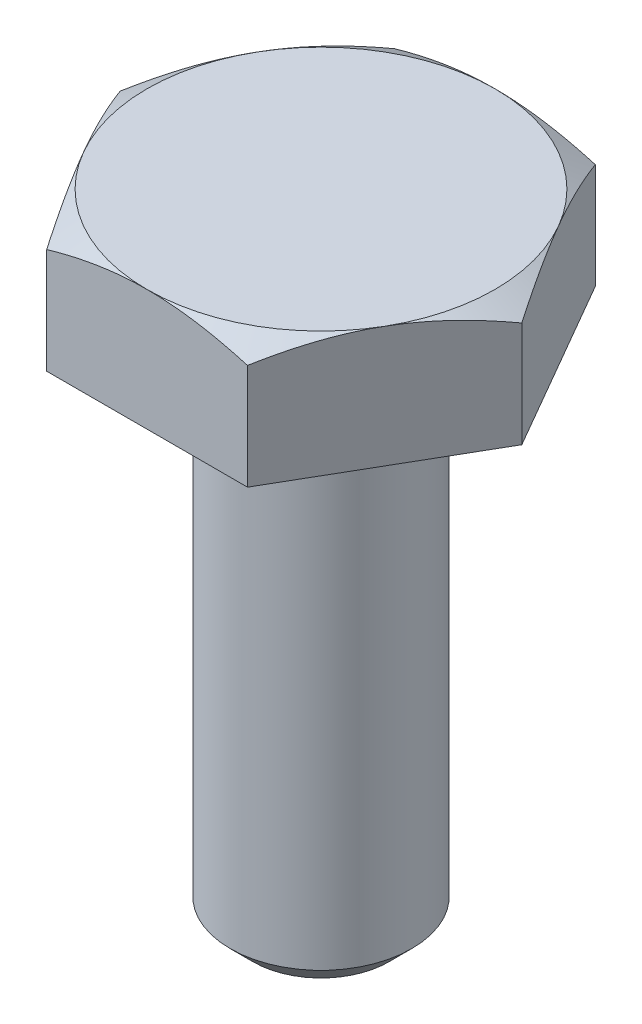
ISO-10303-21;
HEADER;
FILE_DESCRIPTION(('STEP AP214'),'2;1');
FILE_NAME('part.step','',(''),(''),'','','');
FILE_SCHEMA(('AUTOMOTIVE_DESIGN { 1 0 10303 214 1 1 1 1 }'));
ENDSEC;
DATA;
#1=APPLICATION_CONTEXT('core data for automotive mechanical design processes');
#2=APPLICATION_PROTOCOL_DEFINITION('international standard','automotive_design',2000,#1);
#3=PRODUCT_CONTEXT('',#1,'mechanical');
#4=PRODUCT('Part','Part','',(#3));
#5=PRODUCT_RELATED_PRODUCT_CATEGORY('part','',(#4));
#6=PRODUCT_DEFINITION_FORMATION('','',#4);
#7=PRODUCT_DEFINITION_CONTEXT('part definition',#1,'design');
#8=PRODUCT_DEFINITION('design','',#6,#7);
#9=PRODUCT_DEFINITION_SHAPE('','',#8);
#10=(LENGTH_UNIT() NAMED_UNIT(*) SI_UNIT(.MILLI.,.METRE.));
#11=(NAMED_UNIT(*) PLANE_ANGLE_UNIT() SI_UNIT($,.RADIAN.));
#12=(NAMED_UNIT(*) SI_UNIT($,.STERADIAN.) SOLID_ANGLE_UNIT());
#13=UNCERTAINTY_MEASURE_WITH_UNIT(LENGTH_MEASURE(1.E-05),#10,'distance_accuracy_value','');
#14=(GEOMETRIC_REPRESENTATION_CONTEXT(3) GLOBAL_UNCERTAINTY_ASSIGNED_CONTEXT((#13)) GLOBAL_UNIT_ASSIGNED_CONTEXT((#10,
#11,#12)) REPRESENTATION_CONTEXT('',''));
#15=CARTESIAN_POINT('',(0.,0.,0.));
#16=DIRECTION('',(0.,0.,1.));
#17=DIRECTION('',(1.,0.,0.));
#18=AXIS2_PLACEMENT_3D('',#15,#16,#17);
#19=CARTESIAN_POINT('',(0.,-4.,5.75000000000002));
#20=DIRECTION('',(0.,0.,1.));
#21=DIRECTION('',(1.,0.,0.));
#22=AXIS2_PLACEMENT_3D('',#19,#20,#21);
#23=PLANE('',#22);
#24=DIRECTION('',(0.,1.,0.));
#25=VECTOR('',#24,1.);
#26=CARTESIAN_POINT('',(3.31976404784035,-4.,5.75000000000002));
#27=LINE('',#26,#25);
#28=CARTESIAN_POINT('',(3.31976404784035,-4.,5.75000000000002));
#29=VERTEX_POINT('',#28);
#30=CARTESIAN_POINT('',(3.31976404784035,-0.513569285492992,5.75000000000002));
#31=VERTEX_POINT('',#30);
#32=EDGE_CURVE('E223',#29,#31,#27,.T.);
#33=ORIENTED_EDGE('',*,*,#32,.T.);
#34=CARTESIAN_POINT('',(11.0713080173293,-3.88292899514897,5.75000000000002));
#35=CARTESIAN_POINT('',(10.8123781364165,-3.75027954906554,5.75000000000002));
#36=CARTESIAN_POINT('',(10.5530584670346,-3.61838412466597,5.75000000000002));
#37=CARTESIAN_POINT('',(10.0334629710092,-3.35647802069559,5.75000000000002));
#38=CARTESIAN_POINT('',(9.77318712480957,-3.22646737994511,5.75000000000002));
#39=CARTESIAN_POINT('',(9.25107199836374,-2.96849497357768,5.75000000000002));
#40=CARTESIAN_POINT('',(8.98923081792818,-2.84053704683579,5.75000000000002));
#41=CARTESIAN_POINT('',(8.46419557327455,-2.58741309158795,5.75000000000002));
#42=CARTESIAN_POINT('',(8.20100148948035,-2.46224710362129,5.75000000000002));
#43=CARTESIAN_POINT('',(7.65942340661944,-2.20903102302215,5.75000000000002));
#44=CARTESIAN_POINT('',(7.38095389899236,-2.08116329088386,5.75000000000002));
#45=CARTESIAN_POINT('',(6.82184411600571,-1.83028757996101,5.75000000000002));
#46=CARTESIAN_POINT('',(6.54120395474192,-1.70727934779525,5.75000000000002));
#47=CARTESIAN_POINT('',(5.97745013692571,-1.46758165786437,5.75000000000002));
#48=CARTESIAN_POINT('',(5.69433829885842,-1.35088794569363,5.75000000000002));
#49=CARTESIAN_POINT('',(5.12481850383633,-1.12558004469787,5.75000000000002));
#50=CARTESIAN_POINT('',(4.83840976909219,-1.01696780947603,5.75000000000002));
#51=CARTESIAN_POINT('',(4.21157422588185,-0.792382003870331,5.75000000000002));
#52=CARTESIAN_POINT('',(3.87041947555574,-0.67841583327558,5.75000000000002));
#53=CARTESIAN_POINT('',(3.1820331395834,-0.470660731432122,5.75000000000002));
#54=CARTESIAN_POINT('',(2.83480483084519,-0.376861261802617,5.75000000000002));
#55=CARTESIAN_POINT('',(2.31256241062908,-0.257272828446657,5.75000000000002));
#56=CARTESIAN_POINT('',(2.13989891510111,-0.221175363365864,5.75000000000002));
#57=CARTESIAN_POINT('',(1.79317467008834,-0.156396317597844,5.75000000000002));
#58=CARTESIAN_POINT('',(1.61911395732723,-0.127714542654421,5.75000000000002));
#59=CARTESIAN_POINT('',(1.26990567780417,-0.0785939169627074,5.75000000000002));
#60=CARTESIAN_POINT('',(1.09475865311274,-0.0581512457265787,5.75000000000002));
#61=CARTESIAN_POINT('',(0.74364724237383,-0.0261523101735737,5.75000000000002));
#62=CARTESIAN_POINT('',(0.567682862169348,-0.0145959824291443,5.75000000000002));
#63=CARTESIAN_POINT('',(0.213243816290238,-0.000694780216979998,5.75000000000002));
#64=CARTESIAN_POINT('',(0.0347646314813361,0.00153644475867695,5.75000000000002));
#65=CARTESIAN_POINT('',(-0.322053382277163,-0.00360792614545602,5.75000000000002));
#66=CARTESIAN_POINT('',(-0.50039221086625,-0.0109835466207898,5.75000000000002));
#67=CARTESIAN_POINT('',(-0.856489322139348,-0.0350730360006631,5.75000000000002));
#68=CARTESIAN_POINT('',(-1.03424740413895,-0.0517898472946195,5.75000000000002));
#69=CARTESIAN_POINT('',(-1.38870760807907,-0.0939777025012408,5.75000000000002));
#70=CARTESIAN_POINT('',(-1.56540970529434,-0.119448950583023,5.75000000000002));
#71=CARTESIAN_POINT('',(-2.10039223807329,-0.208987600366526,5.75000000000002));
#72=CARTESIAN_POINT('',(-2.45658767310825,-0.285660332649734,5.75000000000002));
#73=CARTESIAN_POINT('',(-3.1623545433874,-0.464500590742711,5.75000000000002));
#74=CARTESIAN_POINT('',(-3.51192430769836,-0.566674458028985,5.75000000000002));
#75=CARTESIAN_POINT('',(-4.18052275964089,-0.781774135701555,5.75000000000002));
#76=CARTESIAN_POINT('',(-4.49996585898247,-0.893432381701488,5.75000000000002));
#77=CARTESIAN_POINT('',(-5.1344552507634,-1.12868043919671,5.75000000000002));
#78=CARTESIAN_POINT('',(-5.4495006120927,-1.25227273485205,5.75000000000002));
#79=CARTESIAN_POINT('',(-6.07625696744593,-1.50843122042611,5.75000000000002));
#80=CARTESIAN_POINT('',(-6.38796436654607,-1.64100614054922,5.75000000000002));
#81=CARTESIAN_POINT('',(-7.00841608296728,-1.91281341705002,5.75000000000002));
#82=CARTESIAN_POINT('',(-7.31716065097914,-2.05204520410644,5.75000000000002));
#83=CARTESIAN_POINT('',(-7.91565699090766,-2.32793407504152,5.75000000000002));
#84=CARTESIAN_POINT('',(-8.20553281049504,-2.46432309625606,5.75000000000002));
#85=CARTESIAN_POINT('',(-8.78357347762647,-2.7406937193813,5.75000000000002));
#86=CARTESIAN_POINT('',(-9.07173827505263,-2.88067542589306,5.75000000000002));
#87=CARTESIAN_POINT('',(-9.64580605137061,-3.16307241905551,5.75000000000002));
#88=CARTESIAN_POINT('',(-9.93171320771523,-3.30547923295431,5.75000000000002));
#89=CARTESIAN_POINT('',(-10.5023383771572,-3.59260033929941,5.75000000000002));
#90=CARTESIAN_POINT('',(-10.787056484661,-3.73731444398362,5.75000000000002));
#91=CARTESIAN_POINT('',(-11.0713080173293,-3.88292899514898,5.75000000000002));
#92=B_SPLINE_CURVE_WITH_KNOTS('',3,(#34,#35,#36,#37,#38,#39,#40,#41,#42,#43,#44,#45,#46,#47,#48,
#49,#50,#51,#52,#53,#54,#55,#56,#57,#58,#59,#60,#61,#62,#63,#64,#65,#66,#67,#68,#69,#70,#71,#72,
#73,#74,#75,#76,#77,#78,#79,#80,#81,#82,#83,#84,#85,#86,#87,#88,#89,#90,#91),.UNSPECIFIED.,.F.,
.F.,(4,2,2,2,2,2,2,2,2,2,2,2,2,2,2,2,2,2,2,2,2,2,2,2,2,2,2,2,4),(0.,0.87279492579926,
1.74560780283092,2.61989747067912,3.49419982506763,4.41343430819262,5.33262079770412,
6.25118007094176,7.16996067861817,8.24860694073194,9.32668816430342,9.85574436116752,
10.3847866978436,10.9135834335683,11.4423763948953,11.9775955477818,12.5128160709444,
13.0482052787734,13.5836069736833,14.675265844376,15.7671964535063,16.7820712051574,
17.7971576677229,18.8132452497826,19.8292460869682,20.7902935537496,21.7513690332513,
22.7095871006485,23.6677275844538),.UNSPECIFIED.);
#93=CARTESIAN_POINT('',(0.,0.,5.75));
#94=VERTEX_POINT('',#93);
#95=EDGE_CURVE('E66',#31,#94,#92,.T.);
#96=ORIENTED_EDGE('',*,*,#95,.T.);
#97=CARTESIAN_POINT('',(-3.31976404784035,-0.513569285492994,5.75000000000002));
#98=VERTEX_POINT('',#97);
#99=EDGE_CURVE('E163',#94,#98,#92,.T.);
#100=ORIENTED_EDGE('',*,*,#99,.T.);
#101=DIRECTION('',(0.,1.,0.));
#102=VECTOR('',#101,1.);
#103=CARTESIAN_POINT('',(-3.31976404784035,-4.,5.75000000000002));
#104=LINE('',#103,#102);
#105=CARTESIAN_POINT('',(-3.31976404784035,-4.,5.75000000000002));
#106=VERTEX_POINT('',#105);
#107=EDGE_CURVE('E240',#106,#98,#104,.T.);
#108=ORIENTED_EDGE('',*,*,#107,.F.);
#109=DIRECTION('',(1.,0.,0.));
#110=VECTOR('',#109,1.);
#111=CARTESIAN_POINT('',(0.,-4.,5.75000000000002));
#112=LINE('',#111,#110);
#113=EDGE_CURVE('E226',#106,#29,#112,.T.);
#114=ORIENTED_EDGE('',*,*,#113,.T.);
#115=EDGE_LOOP('',(#33,#96,#100,#108,#114));
#116=FACE_BOUND('',#115,.T.);
#117=ADVANCED_FACE('F45',(#116),#23,.T.);
#118=CARTESIAN_POINT('',(-4.97964607176053,-4.,2.87500000000001));
#119=DIRECTION('',(-0.866025403784438,0.,0.500000000000001));
#120=DIRECTION('',(0.500000000000001,0.,0.866025403784438));
#121=AXIS2_PLACEMENT_3D('',#118,#119,#120);
#122=PLANE('',#121);
#123=ORIENTED_EDGE('',*,*,#107,.T.);
#124=CARTESIAN_POINT('',(-3.31964857778652,-0.513635953898761,5.75020000000002));
#125=CARTESIAN_POINT('',(-3.3926209133299,-0.471511287144572,5.62380820729191));
#126=CARTESIAN_POINT('',(-3.46586532524055,-0.431298360537734,5.49694516449216));
#127=CARTESIAN_POINT('',(-3.61294897437243,-0.355222524189267,5.24218881123311));
#128=CARTESIAN_POINT('',(-3.68678845365557,-0.319361490988121,5.11429508151029));
#129=CARTESIAN_POINT('',(-3.90948916876067,-0.219010114576463,4.72856612806634));
#130=CARTESIAN_POINT('',(-4.05922948524038,-0.161931182517345,4.46920829198204));
#131=CARTESIAN_POINT('',(-4.28331314780295,-0.0949990243079389,4.08108400327753));
#132=CARTESIAN_POINT('',(-4.35698694396534,-0.0759319138580778,3.95347724513781));
#133=CARTESIAN_POINT('',(-4.50466743828745,-0.0439589649041536,3.69768712568503));
#134=CARTESIAN_POINT('',(-4.57867410644991,-0.0310525820171859,3.56950381632876));
#135=CARTESIAN_POINT('',(-4.72681598465025,-0.0117300113804247,3.31291455655709));
#136=CARTESIAN_POINT('',(-4.80095095271929,-0.00530645784718868,3.18450902524401));
#137=CARTESIAN_POINT('',(-4.94928528827318,0.000919606167718035,2.9275864195577));
#138=CARTESIAN_POINT('',(-5.0234846536979,0.000722321175925226,2.79906934875273));
#139=CARTESIAN_POINT('',(-5.22676904640718,-0.00891904858600412,2.44697045219446));
#140=CARTESIAN_POINT('',(-5.35578753678401,-0.0251059305716255,2.22350387174596));
#141=CARTESIAN_POINT('',(-5.61296758327851,-0.0764356634574781,1.77805496452456));
#142=CARTESIAN_POINT('',(-5.74112823487006,-0.111596060176641,1.55607420443687));
#143=CARTESIAN_POINT('',(-5.99882589662087,-0.199487238443291,1.10972876129276));
#144=CARTESIAN_POINT('',(-6.12833038860442,-0.252590422248932,0.885420401368853));
#145=CARTESIAN_POINT('',(-6.38540804552934,-0.373113373525025,0.440148838084137));
#146=CARTESIAN_POINT('',(-6.51298450303054,-0.440504828899112,0.219179931842406));
#147=CARTESIAN_POINT('',(-6.63964356573455,-0.513635953898759,-0.000199999999991778));
#148=B_SPLINE_CURVE_WITH_KNOTS('',3,(#124,#125,#126,#127,#128,#129,#130,#131,#132,#133,#134,
#135,#136,#137,#138,#139,#140,#141,#142,#143,#144,#145,#146,#147),.UNSPECIFIED.,.F.,.F.,(4,2,2,
2,2,2,2,2,2,2,2,4),(0.,0.455670765670929,0.911537324052956,1.82516476021489,2.27078912336574,
2.71637410233498,3.16145223624437,3.60651662110896,4.38133614054356,5.15687340779608,
5.94961152801382,6.74079328409406),.UNSPECIFIED.);
#149=CARTESIAN_POINT('',(-4.97964607176052,0.,2.875));
#150=VERTEX_POINT('',#149);
#151=EDGE_CURVE('E264',#98,#150,#148,.T.);
#152=ORIENTED_EDGE('',*,*,#151,.T.);
#153=CARTESIAN_POINT('',(-6.63952809568071,-0.513569285492993,0.));
#154=VERTEX_POINT('',#153);
#155=EDGE_CURVE('E189',#150,#154,#148,.T.);
#156=ORIENTED_EDGE('',*,*,#155,.T.);
#157=DIRECTION('',(0.,1.,0.));
#158=VECTOR('',#157,1.);
#159=CARTESIAN_POINT('',(-6.63952809568071,-4.,0.));
#160=LINE('',#159,#158);
#161=CARTESIAN_POINT('',(-6.63952809568071,-4.,0.));
#162=VERTEX_POINT('',#161);
#163=EDGE_CURVE('E270',#162,#154,#160,.T.);
#164=ORIENTED_EDGE('',*,*,#163,.F.);
#165=DIRECTION('',(0.500000000000001,0.,0.866025403784438));
#166=VECTOR('',#165,1.);
#167=CARTESIAN_POINT('',(-4.97964607176053,-4.,2.87500000000001));
#168=LINE('',#167,#166);
#169=EDGE_CURVE('E228',#162,#106,#168,.T.);
#170=ORIENTED_EDGE('',*,*,#169,.T.);
#171=EDGE_LOOP('',(#123,#152,#156,#164,#170));
#172=FACE_BOUND('',#171,.T.);
#173=ADVANCED_FACE('F199',(#172),#122,.T.);
#174=CARTESIAN_POINT('',(-4.97964607176054,-4.,-2.875));
#175=DIRECTION('',(-0.866025403784439,0.,-0.499999999999999));
#176=DIRECTION('',(-0.499999999999999,0.,0.866025403784439));
#177=AXIS2_PLACEMENT_3D('',#174,#175,#176);
#178=PLANE('',#177);
#179=ORIENTED_EDGE('',*,*,#163,.T.);
#180=CARTESIAN_POINT('',(-6.63964356573455,-0.51363595389876,0.000200000000007373));
#181=CARTESIAN_POINT('',(-6.56667123019117,-0.471511287144571,-0.126191792708097));
#182=CARTESIAN_POINT('',(-6.49342681828051,-0.431298360537732,-0.253054835507854));
#183=CARTESIAN_POINT('',(-6.34634316914863,-0.355222524189265,-0.507811188766905));
#184=CARTESIAN_POINT('',(-6.2725036898655,-0.31936149098812,-0.635704918489725));
#185=CARTESIAN_POINT('',(-6.0498029747604,-0.219010114576462,-1.02143387193367));
#186=CARTESIAN_POINT('',(-5.90006265828069,-0.161931182517343,-1.28079170801797));
#187=CARTESIAN_POINT('',(-5.67597899571811,-0.094999024307937,-1.66891599672248));
#188=CARTESIAN_POINT('',(-5.60230519955573,-0.0759319138580761,-1.7965227548622));
#189=CARTESIAN_POINT('',(-5.45462470523362,-0.043958964904152,-2.05231287431499));
#190=CARTESIAN_POINT('',(-5.38061803707116,-0.0310525820171843,-2.18049618367125));
#191=CARTESIAN_POINT('',(-5.23247615887082,-0.0117300113804233,-2.43708544344292));
#192=CARTESIAN_POINT('',(-5.15834119080178,-0.00530645784718743,-2.565490974756));
#193=CARTESIAN_POINT('',(-5.01000685524789,0.000919606167719156,-2.82241358044231));
#194=CARTESIAN_POINT('',(-4.93580748982317,0.000722321175926425,-2.95093065124729));
#195=CARTESIAN_POINT('',(-4.73252309711389,-0.00891904858600286,-3.30302954780555));
#196=CARTESIAN_POINT('',(-4.60350460673706,-0.0251059305716244,-3.52649612825406));
#197=CARTESIAN_POINT('',(-4.34632456024256,-0.0764356634574774,-3.97194503547546));
#198=CARTESIAN_POINT('',(-4.21816390865101,-0.11159606017664,-4.19392579556316));
#199=CARTESIAN_POINT('',(-3.9604662469002,-0.199487238443292,-4.64027123870726));
#200=CARTESIAN_POINT('',(-3.83096175491664,-0.252590422248934,-4.86457959863117));
#201=CARTESIAN_POINT('',(-3.57388409799173,-0.373113373525028,-5.3098511619159));
#202=CARTESIAN_POINT('',(-3.44630764049053,-0.440504828899116,-5.53082006815763));
#203=CARTESIAN_POINT('',(-3.31964857778652,-0.513635953898764,-5.75020000000003));
#204=B_SPLINE_CURVE_WITH_KNOTS('',3,(#180,#181,#182,#183,#184,#185,#186,#187,#188,#189,#190,
#191,#192,#193,#194,#195,#196,#197,#198,#199,#200,#201,#202,#203),.UNSPECIFIED.,.F.,.F.,(4,2,2,
2,2,2,2,2,2,2,2,4),(0.,0.455670765670929,0.911537324052957,1.82516476021489,2.27078912336574,
2.71637410233498,3.16145223624436,3.60651662110896,4.38133614054357,5.15687340779609,
5.94961152801384,6.74079328409408),.UNSPECIFIED.);
#205=CARTESIAN_POINT('',(-4.97964607176052,0.,-2.87499999999999));
#206=VERTEX_POINT('',#205);
#207=EDGE_CURVE('E187',#154,#206,#204,.T.);
#208=ORIENTED_EDGE('',*,*,#207,.T.);
#209=CARTESIAN_POINT('',(-3.31976404784035,-0.513569285492998,-5.75000000000003));
#210=VERTEX_POINT('',#209);
#211=EDGE_CURVE('E180',#206,#210,#204,.T.);
#212=ORIENTED_EDGE('',*,*,#211,.T.);
#213=DIRECTION('',(0.,1.,0.));
#214=VECTOR('',#213,1.);
#215=CARTESIAN_POINT('',(-3.31976404784035,-4.,-5.75000000000003));
#216=LINE('',#215,#214);
#217=CARTESIAN_POINT('',(-3.31976404784035,-4.,-5.75000000000003));
#218=VERTEX_POINT('',#217);
#219=EDGE_CURVE('E256',#218,#210,#216,.T.);
#220=ORIENTED_EDGE('',*,*,#219,.F.);
#221=DIRECTION('',(-0.499999999999999,0.,0.866025403784439));
#222=VECTOR('',#221,1.);
#223=CARTESIAN_POINT('',(-4.97964607176054,-4.,-2.875));
#224=LINE('',#223,#222);
#225=EDGE_CURVE('E233',#218,#162,#224,.T.);
#226=ORIENTED_EDGE('',*,*,#225,.T.);
#227=EDGE_LOOP('',(#179,#208,#212,#220,#226));
#228=FACE_BOUND('',#227,.T.);
#229=ADVANCED_FACE('F195',(#228),#178,.T.);
#230=CARTESIAN_POINT('',(0.,-4.,-5.75000000000003));
#231=DIRECTION('',(0.,0.,-1.));
#232=DIRECTION('',(-1.,0.,0.));
#233=AXIS2_PLACEMENT_3D('',#230,#231,#232);
#234=PLANE('',#233);
#235=ORIENTED_EDGE('',*,*,#219,.T.);
#236=CARTESIAN_POINT('',(-11.0713080173293,-3.88292899514897,-5.75000000000003));
#237=CARTESIAN_POINT('',(-10.8123781364165,-3.75027954906554,-5.75000000000003));
#238=CARTESIAN_POINT('',(-10.5530584670346,-3.61838412466597,-5.75000000000003));
#239=CARTESIAN_POINT('',(-10.0334629710092,-3.35647802069559,-5.75000000000003));
#240=CARTESIAN_POINT('',(-9.77318712480956,-3.22646737994511,-5.75000000000003));
#241=CARTESIAN_POINT('',(-9.25107199836373,-2.96849497357768,-5.75000000000003));
#242=CARTESIAN_POINT('',(-8.98923081792817,-2.84053704683579,-5.75000000000003));
#243=CARTESIAN_POINT('',(-8.46419557327455,-2.58741309158795,-5.75000000000003));
#244=CARTESIAN_POINT('',(-8.20100148948035,-2.46224710362128,-5.75000000000003));
#245=CARTESIAN_POINT('',(-7.65942340661943,-2.20903102302215,-5.75000000000003));
#246=CARTESIAN_POINT('',(-7.38095389899236,-2.08116329088387,-5.75000000000003));
#247=CARTESIAN_POINT('',(-6.82184411600571,-1.83028757996101,-5.75000000000003));
#248=CARTESIAN_POINT('',(-6.54120395474191,-1.70727934779525,-5.75000000000003));
#249=CARTESIAN_POINT('',(-5.97745013692571,-1.46758165786437,-5.75000000000003));
#250=CARTESIAN_POINT('',(-5.69433829885842,-1.35088794569364,-5.75000000000003));
#251=CARTESIAN_POINT('',(-5.12481850383632,-1.12558004469788,-5.75000000000003));
#252=CARTESIAN_POINT('',(-4.83840976909219,-1.01696780947603,-5.75000000000003));
#253=CARTESIAN_POINT('',(-4.21157422588185,-0.792382003870332,-5.75000000000003));
#254=CARTESIAN_POINT('',(-3.87041947555574,-0.678415833275582,-5.75000000000003));
#255=CARTESIAN_POINT('',(-3.1820331395834,-0.470660731432124,-5.75000000000003));
#256=CARTESIAN_POINT('',(-2.83480483084518,-0.376861261802619,-5.75000000000003));
#257=CARTESIAN_POINT('',(-2.31256241062908,-0.257272828446659,-5.75000000000003));
#258=CARTESIAN_POINT('',(-2.13989891510111,-0.221175363365866,-5.75000000000003));
#259=CARTESIAN_POINT('',(-1.79317467008833,-0.156396317597847,-5.75000000000003));
#260=CARTESIAN_POINT('',(-1.61911395732722,-0.127714542654423,-5.75000000000003));
#261=CARTESIAN_POINT('',(-1.26990567780416,-0.0785939169627099,-5.75000000000003));
#262=CARTESIAN_POINT('',(-1.09475865311274,-0.0581512457265815,-5.75000000000003));
#263=CARTESIAN_POINT('',(-0.743647242373822,-0.026152310173577,-5.75000000000003));
#264=CARTESIAN_POINT('',(-0.56768286216934,-0.0145959824291476,-5.75000000000003));
#265=CARTESIAN_POINT('',(-0.21324381629023,-0.000694780216983662,-5.75000000000003));
#266=CARTESIAN_POINT('',(-0.034764631481327,0.001536444758673,-5.75000000000003));
#267=CARTESIAN_POINT('',(0.322053382277173,-0.00360792614546008,-5.75000000000003));
#268=CARTESIAN_POINT('',(0.500392210866259,-0.0109835466207936,-5.75000000000003));
#269=CARTESIAN_POINT('',(0.856489322139358,-0.0350730360006673,-5.75000000000003));
#270=CARTESIAN_POINT('',(1.03424740413896,-0.0517898472946242,-5.75000000000003));
#271=CARTESIAN_POINT('',(1.38870760807908,-0.0939777025012461,-5.75000000000003));
#272=CARTESIAN_POINT('',(1.56540970529435,-0.119448950583028,-5.75000000000003));
#273=CARTESIAN_POINT('',(2.1003922380733,-0.208987600366532,-5.75000000000003));
#274=CARTESIAN_POINT('',(2.45658767310826,-0.28566033264974,-5.75000000000003));
#275=CARTESIAN_POINT('',(3.16235454338741,-0.464500590742717,-5.75000000000003));
#276=CARTESIAN_POINT('',(3.51192430769837,-0.566674458028992,-5.75000000000003));
#277=CARTESIAN_POINT('',(4.18052275964089,-0.781774135701562,-5.75000000000003));
#278=CARTESIAN_POINT('',(4.49996585898248,-0.893432381701493,-5.75000000000003));
#279=CARTESIAN_POINT('',(5.1344552507634,-1.12868043919672,-5.75000000000003));
#280=CARTESIAN_POINT('',(5.4495006120927,-1.25227273485205,-5.75000000000003));
#281=CARTESIAN_POINT('',(6.07625696744593,-1.50843122042611,-5.75000000000003));
#282=CARTESIAN_POINT('',(6.38796436654607,-1.64100614054922,-5.75000000000003));
#283=CARTESIAN_POINT('',(7.00841608296727,-1.91281341705002,-5.75000000000003));
#284=CARTESIAN_POINT('',(7.31716065097913,-2.05204520410644,-5.75000000000003));
#285=CARTESIAN_POINT('',(7.91565699090765,-2.32793407504152,-5.75000000000003));
#286=CARTESIAN_POINT('',(8.20553281049503,-2.46432309625606,-5.75000000000003));
#287=CARTESIAN_POINT('',(8.78357347762645,-2.74069371938129,-5.75000000000003));
#288=CARTESIAN_POINT('',(9.07173827505261,-2.88067542589306,-5.75000000000003));
#289=CARTESIAN_POINT('',(9.64580605137058,-3.1630724190555,-5.75000000000003));
#290=CARTESIAN_POINT('',(9.93171320771521,-3.3054792329543,-5.75000000000003));
#291=CARTESIAN_POINT('',(10.5023383771571,-3.5926003392994,-5.75000000000003));
#292=CARTESIAN_POINT('',(10.7870564846609,-3.7373144439836,-5.75000000000003));
#293=CARTESIAN_POINT('',(11.0713080173293,-3.88292899514896,-5.75000000000003));
#294=B_SPLINE_CURVE_WITH_KNOTS('',3,(#236,#237,#238,#239,#240,#241,#242,#243,#244,#245,#246,
#247,#248,#249,#250,#251,#252,#253,#254,#255,#256,#257,#258,#259,#260,#261,#262,#263,#264,#265,
#266,#267,#268,#269,#270,#271,#272,#273,#274,#275,#276,#277,#278,#279,#280,#281,#282,#283,#284,
#285,#286,#287,#288,#289,#290,#291,#292,#293),.UNSPECIFIED.,.F.,.F.,(4,2,2,2,2,2,2,2,2,2,2,2,2,
2,2,2,2,2,2,2,2,2,2,2,2,2,2,2,4),(0.,0.872794925799259,1.74560780283092,2.61989747067912,
3.49419982506763,4.41343430819262,5.33262079770412,6.25118007094175,7.16996067861816,
8.24860694073194,9.32668816430342,9.85574436116752,10.3847866978436,10.9135834335683,
11.4423763948953,11.9775955477818,12.5128160709444,13.0482052787734,13.5836069736833,
14.675265844376,15.7671964535063,16.7820712051574,17.7971576677229,18.8132452497826,
19.8292460869682,20.7902935537496,21.7513690332513,22.7095871006484,23.6677275844537),.UNSPECIFIED.);
#295=CARTESIAN_POINT('',(0.,0.,-5.75));
#296=VERTEX_POINT('',#295);
#297=EDGE_CURVE('E188',#210,#296,#294,.T.);
#298=ORIENTED_EDGE('',*,*,#297,.T.);
#299=CARTESIAN_POINT('',(3.31976404784033,-0.513569285492992,-5.75000000000003));
#300=VERTEX_POINT('',#299);
#301=EDGE_CURVE('E173',#296,#300,#294,.T.);
#302=ORIENTED_EDGE('',*,*,#301,.T.);
#303=DIRECTION('',(0.,1.,0.));
#304=VECTOR('',#303,1.);
#305=CARTESIAN_POINT('',(3.31976404784033,-4.,-5.75000000000003));
#306=LINE('',#305,#304);
#307=CARTESIAN_POINT('',(3.31976404784033,-4.,-5.75000000000003));
#308=VERTEX_POINT('',#307);
#309=EDGE_CURVE('E230',#308,#300,#306,.T.);
#310=ORIENTED_EDGE('',*,*,#309,.F.);
#311=DIRECTION('',(-1.,0.,0.));
#312=VECTOR('',#311,1.);
#313=CARTESIAN_POINT('',(0.,-4.,-5.75000000000003));
#314=LINE('',#313,#312);
#315=EDGE_CURVE('E277',#308,#218,#314,.T.);
#316=ORIENTED_EDGE('',*,*,#315,.T.);
#317=EDGE_LOOP('',(#235,#298,#302,#310,#316));
#318=FACE_BOUND('',#317,.T.);
#319=ADVANCED_FACE('F198',(#318),#234,.T.);
#320=CARTESIAN_POINT('',(4.97964607176052,-4.,-2.875));
#321=DIRECTION('',(0.866025403784439,0.,-0.5));
#322=DIRECTION('',(-0.5,0.,-0.866025403784439));
#323=AXIS2_PLACEMENT_3D('',#320,#321,#322);
#324=PLANE('',#323);
#325=ORIENTED_EDGE('',*,*,#309,.T.);
#326=CARTESIAN_POINT('',(3.3196485777865,-0.513635953898759,-5.75020000000003));
#327=CARTESIAN_POINT('',(3.39262091332988,-0.47151128714457,-5.62380820729192));
#328=CARTESIAN_POINT('',(3.46586532524053,-0.431298360537731,-5.49694516449216));
#329=CARTESIAN_POINT('',(3.61294897437241,-0.355222524189263,-5.24218881123311));
#330=CARTESIAN_POINT('',(3.68678845365555,-0.319361490988117,-5.11429508151029));
#331=CARTESIAN_POINT('',(3.90948916876064,-0.219010114576459,-4.72856612806635));
#332=CARTESIAN_POINT('',(4.05922948524035,-0.16193118251734,-4.46920829198205));
#333=CARTESIAN_POINT('',(4.28331314780293,-0.0949990243079327,-4.08108400327754));
#334=CARTESIAN_POINT('',(4.35698694396532,-0.0759319138580717,-3.95347724513782));
#335=CARTESIAN_POINT('',(4.50466743828743,-0.0439589649041468,-3.69768712568504));
#336=CARTESIAN_POINT('',(4.57867410644988,-0.0310525820171784,-3.56950381632877));
#337=CARTESIAN_POINT('',(4.72681598465022,-0.0117300113804163,-3.3129145565571));
#338=CARTESIAN_POINT('',(4.80095095271927,-0.00530645784718006,-3.18450902524402));
#339=CARTESIAN_POINT('',(4.94928528827316,0.000919606167727109,-2.92758641955771));
#340=CARTESIAN_POINT('',(5.02348465369787,0.000722321175934625,-2.79906934875273));
#341=CARTESIAN_POINT('',(5.22676904640716,-0.0089190485859937,-2.44697045219447));
#342=CARTESIAN_POINT('',(5.35578753678399,-0.0251059305716144,-2.22350387174596));
#343=CARTESIAN_POINT('',(5.61296758327849,-0.0764356634574667,-1.77805496452456));
#344=CARTESIAN_POINT('',(5.74112823487004,-0.11159606017663,-1.55607420443687));
#345=CARTESIAN_POINT('',(5.99882589662085,-0.199487238443281,-1.10972876129276));
#346=CARTESIAN_POINT('',(6.12833038860441,-0.252590422248922,-0.885420401368845));
#347=CARTESIAN_POINT('',(6.38540804552932,-0.373113373525016,-0.440148838084125));
#348=CARTESIAN_POINT('',(6.51298450303053,-0.440504828899104,-0.219179931842392));
#349=CARTESIAN_POINT('',(6.63964356573454,-0.513635953898752,0.000200000000007309));
#350=B_SPLINE_CURVE_WITH_KNOTS('',3,(#326,#327,#328,#329,#330,#331,#332,#333,#334,#335,#336,
#337,#338,#339,#340,#341,#342,#343,#344,#345,#346,#347,#348,#349),.UNSPECIFIED.,.F.,.F.,(4,2,2,
2,2,2,2,2,2,2,2,4),(0.,0.455670765670929,0.911537324052956,1.82516476021488,2.27078912336574,
2.71637410233498,3.16145223624436,3.60651662110896,4.38133614054357,5.15687340779609,
5.94961152801384,6.74079328409408),.UNSPECIFIED.);
#351=CARTESIAN_POINT('',(4.97964607176052,0.,-2.875));
#352=VERTEX_POINT('',#351);
#353=EDGE_CURVE('E139',#300,#352,#350,.T.);
#354=ORIENTED_EDGE('',*,*,#353,.T.);
#355=CARTESIAN_POINT('',(6.6395280956807,-0.513569285492984,0.));
#356=VERTEX_POINT('',#355);
#357=EDGE_CURVE('E125',#352,#356,#350,.T.);
#358=ORIENTED_EDGE('',*,*,#357,.T.);
#359=DIRECTION('',(0.,1.,0.));
#360=VECTOR('',#359,1.);
#361=CARTESIAN_POINT('',(6.6395280956807,-4.,0.));
#362=LINE('',#361,#360);
#363=CARTESIAN_POINT('',(6.6395280956807,-4.,0.));
#364=VERTEX_POINT('',#363);
#365=EDGE_CURVE('E138',#364,#356,#362,.T.);
#366=ORIENTED_EDGE('',*,*,#365,.F.);
#367=DIRECTION('',(-0.5,0.,-0.866025403784439));
#368=VECTOR('',#367,1.);
#369=CARTESIAN_POINT('',(4.97964607176052,-4.,-2.875));
#370=LINE('',#369,#368);
#371=EDGE_CURVE('E279',#364,#308,#370,.T.);
#372=ORIENTED_EDGE('',*,*,#371,.T.);
#373=EDGE_LOOP('',(#325,#354,#358,#366,#372));
#374=FACE_BOUND('',#373,.T.);
#375=ADVANCED_FACE('F205',(#374),#324,.T.);
#376=CARTESIAN_POINT('',(4.97964607176053,-4.,2.875));
#377=DIRECTION('',(0.866025403784439,0.,0.5));
#378=DIRECTION('',(0.5,0.,-0.866025403784439));
#379=AXIS2_PLACEMENT_3D('',#376,#377,#378);
#380=PLANE('',#379);
#381=ORIENTED_EDGE('',*,*,#365,.T.);
#382=CARTESIAN_POINT('',(6.63964356573454,-0.513635953898751,-0.000199999999992627));
#383=CARTESIAN_POINT('',(6.56667123019115,-0.471511287144563,0.126191792708112));
#384=CARTESIAN_POINT('',(6.4934268182805,-0.431298360537724,0.253054835507868));
#385=CARTESIAN_POINT('',(6.34634316914862,-0.355222524189258,0.507811188766918));
#386=CARTESIAN_POINT('',(6.27250368986548,-0.319361490988112,0.635704918489738));
#387=CARTESIAN_POINT('',(6.04980297476039,-0.219010114576455,1.02143387193369));
#388=CARTESIAN_POINT('',(5.90006265828068,-0.161931182517337,1.28079170801798));
#389=CARTESIAN_POINT('',(5.6759789957181,-0.0949990243079316,1.66891599672249));
#390=CARTESIAN_POINT('',(5.60230519955572,-0.075931913858071,1.79652275486221));
#391=CARTESIAN_POINT('',(5.45462470523361,-0.043958964904147,2.052312874315));
#392=CARTESIAN_POINT('',(5.38061803707115,-0.031052582017179,2.18049618367126));
#393=CARTESIAN_POINT('',(5.23247615887081,-0.0117300113804181,2.43708544344293));
#394=CARTESIAN_POINT('',(5.15834119080176,-0.00530645784718265,2.56549097475601));
#395=CARTESIAN_POINT('',(5.01000685524788,0.000919606167723652,2.82241358044232));
#396=CARTESIAN_POINT('',(4.93580748982316,0.000722321175931022,2.95093065124729));
#397=CARTESIAN_POINT('',(4.73252309711388,-0.00891904858599835,3.30302954780556));
#398=CARTESIAN_POINT('',(4.60350460673705,-0.0251059305716204,3.52649612825406));
#399=CARTESIAN_POINT('',(4.34632456024255,-0.0764356634574737,3.97194503547546));
#400=CARTESIAN_POINT('',(4.218163908651,-0.111596060176636,4.19392579556316));
#401=CARTESIAN_POINT('',(3.96046624690019,-0.199487238443288,4.64027123870726));
#402=CARTESIAN_POINT('',(3.83096175491663,-0.25259042224893,4.86457959863117));
#403=CARTESIAN_POINT('',(3.57388409799172,-0.373113373525024,5.30985116191589));
#404=CARTESIAN_POINT('',(3.44630764049052,-0.440504828899112,5.53082006815762));
#405=CARTESIAN_POINT('',(3.31964857778651,-0.513635953898759,5.75020000000002));
#406=B_SPLINE_CURVE_WITH_KNOTS('',3,(#382,#383,#384,#385,#386,#387,#388,#389,#390,#391,#392,
#393,#394,#395,#396,#397,#398,#399,#400,#401,#402,#403,#404,#405),.UNSPECIFIED.,.F.,.F.,(4,2,2,
2,2,2,2,2,2,2,2,4),(0.,0.455670765670928,0.911537324052955,1.82516476021488,2.27078912336574,
2.71637410233497,3.16145223624436,3.60651662110895,4.38133614054355,5.15687340779608,
5.94961152801382,6.74079328409405),.UNSPECIFIED.);
#407=CARTESIAN_POINT('',(4.97964607176052,0.,2.875));
#408=VERTEX_POINT('',#407);
#409=EDGE_CURVE('E120',#356,#408,#406,.T.);
#410=ORIENTED_EDGE('',*,*,#409,.T.);
#411=EDGE_CURVE('E114',#408,#31,#406,.T.);
#412=ORIENTED_EDGE('',*,*,#411,.T.);
#413=ORIENTED_EDGE('',*,*,#32,.F.);
#414=DIRECTION('',(0.5,0.,-0.866025403784439));
#415=VECTOR('',#414,1.);
#416=CARTESIAN_POINT('',(4.97964607176053,-4.,2.875));
#417=LINE('',#416,#415);
#418=EDGE_CURVE('E281',#29,#364,#417,.T.);
#419=ORIENTED_EDGE('',*,*,#418,.T.);
#420=EDGE_LOOP('',(#381,#410,#412,#413,#419));
#421=FACE_BOUND('',#420,.T.);
#422=ADVANCED_FACE('F136',(#421),#380,.T.);
#423=CARTESIAN_POINT('',(0.,-4.,0.));
#424=DIRECTION('',(0.,1.,0.));
#425=DIRECTION('',(0.,0.,1.));
#426=AXIS2_PLACEMENT_3D('',#423,#424,#425);
#427=PLANE('',#426);
#428=CARTESIAN_POINT('',(0.,-4.,0.));
#429=DIRECTION('',(0.,1.,0.));
#430=DIRECTION('',(0.,0.,1.));
#431=AXIS2_PLACEMENT_3D('',#428,#429,#430);
#432=CIRCLE('',#431,3.);
#433=CARTESIAN_POINT('',(0.,-4.,3.));
#434=VERTEX_POINT('',#433);
#435=EDGE_CURVE('E268',#434,#434,#432,.T.);
#436=ORIENTED_EDGE('',*,*,#435,.T.);
#437=EDGE_LOOP('',(#436));
#438=FACE_BOUND('',#437,.T.);
#439=ORIENTED_EDGE('',*,*,#113,.F.);
#440=ORIENTED_EDGE('',*,*,#169,.F.);
#441=ORIENTED_EDGE('',*,*,#225,.F.);
#442=ORIENTED_EDGE('',*,*,#315,.F.);
#443=ORIENTED_EDGE('',*,*,#371,.F.);
#444=ORIENTED_EDGE('',*,*,#418,.F.);
#445=EDGE_LOOP('',(#439,#440,#441,#442,#443,#444));
#446=FACE_BOUND('',#445,.T.);
#447=ADVANCED_FACE('F213',(#438,#446),#427,.F.);
#448=CARTESIAN_POINT('',(0.,-21.,0.));
#449=DIRECTION('',(0.,1.,0.));
#450=DIRECTION('',(0.,0.,1.));
#451=AXIS2_PLACEMENT_3D('',#448,#449,#450);
#452=CYLINDRICAL_SURFACE('',#451,3.);
#453=CARTESIAN_POINT('',(0.,-20.25,0.));
#454=DIRECTION('',(0.,1.,0.));
#455=DIRECTION('',(0.,0.,1.));
#456=AXIS2_PLACEMENT_3D('',#453,#454,#455);
#457=CIRCLE('',#456,3.);
#458=CARTESIAN_POINT('',(0.,-20.25,3.));
#459=VERTEX_POINT('',#458);
#460=EDGE_CURVE('E237',#459,#459,#457,.T.);
#461=CARTESIAN_POINT('',(0.,-20.25,3.));
#462=CARTESIAN_POINT('',(0.,-20.0807291666667,3.));
#463=CARTESIAN_POINT('',(0.,-19.9114583333333,3.));
#464=CARTESIAN_POINT('',(0.,-19.5729166666667,3.));
#465=CARTESIAN_POINT('',(0.,-19.4036458333333,3.));
#466=CARTESIAN_POINT('',(0.,-19.0651041666667,3.));
#467=CARTESIAN_POINT('',(0.,-18.8958333333333,3.));
#468=CARTESIAN_POINT('',(0.,-18.5572916666667,3.));
#469=CARTESIAN_POINT('',(0.,-18.3880208333333,3.));
#470=CARTESIAN_POINT('',(0.,-18.0494791666667,3.));
#471=CARTESIAN_POINT('',(0.,-17.8802083333333,3.));
#472=CARTESIAN_POINT('',(0.,-17.5416666666667,3.));
#473=CARTESIAN_POINT('',(0.,-17.3723958333333,3.));
#474=CARTESIAN_POINT('',(0.,-17.0338541666667,3.));
#475=CARTESIAN_POINT('',(0.,-16.8645833333333,3.));
#476=CARTESIAN_POINT('',(0.,-16.5260416666667,3.));
#477=CARTESIAN_POINT('',(0.,-16.3567708333333,3.));
#478=CARTESIAN_POINT('',(0.,-16.0182291666667,3.));
#479=CARTESIAN_POINT('',(0.,-15.8489583333333,3.));
#480=CARTESIAN_POINT('',(0.,-15.5104166666667,3.));
#481=CARTESIAN_POINT('',(0.,-15.3411458333333,3.));
#482=CARTESIAN_POINT('',(0.,-15.0026041666667,3.));
#483=CARTESIAN_POINT('',(0.,-14.8333333333333,3.));
#484=CARTESIAN_POINT('',(0.,-14.4947916666667,3.));
#485=CARTESIAN_POINT('',(0.,-14.3255208333333,3.));
#486=CARTESIAN_POINT('',(0.,-13.9869791666667,3.));
#487=CARTESIAN_POINT('',(0.,-13.8177083333333,3.));
#488=CARTESIAN_POINT('',(0.,-13.4791666666667,3.));
#489=CARTESIAN_POINT('',(0.,-13.3098958333333,3.));
#490=CARTESIAN_POINT('',(0.,-12.9713541666667,3.));
#491=CARTESIAN_POINT('',(0.,-12.8020833333333,3.));
#492=CARTESIAN_POINT('',(0.,-12.4635416666667,3.));
#493=CARTESIAN_POINT('',(0.,-12.2942708333333,3.));
#494=CARTESIAN_POINT('',(0.,-11.9557291666667,3.));
#495=CARTESIAN_POINT('',(0.,-11.7864583333333,3.));
#496=CARTESIAN_POINT('',(0.,-11.4479166666667,3.));
#497=CARTESIAN_POINT('',(0.,-11.2786458333333,3.));
#498=CARTESIAN_POINT('',(0.,-10.9401041666667,3.));
#499=CARTESIAN_POINT('',(0.,-10.7708333333333,3.));
#500=CARTESIAN_POINT('',(0.,-10.4322916666667,3.));
#501=CARTESIAN_POINT('',(0.,-10.2630208333333,3.));
#502=CARTESIAN_POINT('',(0.,-9.92447916666666,3.));
#503=CARTESIAN_POINT('',(0.,-9.75520833333333,3.));
#504=CARTESIAN_POINT('',(0.,-9.41666666666666,3.));
#505=CARTESIAN_POINT('',(0.,-9.24739583333333,3.));
#506=CARTESIAN_POINT('',(0.,-8.90885416666666,3.));
#507=CARTESIAN_POINT('',(0.,-8.73958333333333,3.));
#508=CARTESIAN_POINT('',(0.,-8.40104166666666,3.));
#509=CARTESIAN_POINT('',(0.,-8.23177083333333,3.));
#510=CARTESIAN_POINT('',(0.,-7.89322916666666,3.));
#511=CARTESIAN_POINT('',(0.,-7.72395833333333,3.));
#512=CARTESIAN_POINT('',(0.,-7.38541666666667,3.));
#513=CARTESIAN_POINT('',(0.,-7.21614583333333,3.));
#514=CARTESIAN_POINT('',(0.,-6.87760416666667,3.));
#515=CARTESIAN_POINT('',(0.,-6.70833333333333,3.));
#516=CARTESIAN_POINT('',(0.,-6.36979166666667,3.));
#517=CARTESIAN_POINT('',(0.,-6.20052083333333,3.));
#518=CARTESIAN_POINT('',(0.,-5.86197916666667,3.));
#519=CARTESIAN_POINT('',(0.,-5.69270833333333,3.));
#520=CARTESIAN_POINT('',(0.,-5.35416666666667,3.));
#521=CARTESIAN_POINT('',(0.,-5.18489583333333,3.));
#522=CARTESIAN_POINT('',(0.,-4.84635416666667,3.));
#523=CARTESIAN_POINT('',(0.,-4.67708333333333,3.));
#524=CARTESIAN_POINT('',(0.,-4.33854166666667,3.));
#525=CARTESIAN_POINT('',(0.,-4.16927083333334,3.));
#526=CARTESIAN_POINT('',(0.,-4.,3.));
#527=B_SPLINE_CURVE_WITH_KNOTS('',3,(#461,#462,#463,#464,#465,#466,#467,#468,#469,#470,#471,
#472,#473,#474,#475,#476,#477,#478,#479,#480,#481,#482,#483,#484,#485,#486,#487,#488,#489,#490,
#491,#492,#493,#494,#495,#496,#497,#498,#499,#500,#501,#502,#503,#504,#505,#506,#507,#508,#509,
#510,#511,#512,#513,#514,#515,#516,#517,#518,#519,#520,#521,#522,#523,#524,#525,#526),
.UNSPECIFIED.,.F.,.F.,(4,2,2,2,2,2,2,2,2,2,2,2,2,2,2,2,2,2,2,2,2,2,2,2,2,2,2,2,2,2,2,2,4),(0.,
0.5078125,1.015625,1.5234375,2.03125,2.5390625,3.046875,3.5546875,4.0625,4.5703125,5.078125,
5.5859375,6.09375,6.6015625,7.109375,7.6171875,8.125,8.6328125,9.140625,9.6484375,10.15625,
10.6640625,11.171875,11.6796875,12.1875,12.6953125,13.203125,13.7109375,14.21875,14.7265625,
15.234375,15.7421875,16.25),.UNSPECIFIED.);
#528=EDGE_CURVE('BSEAM288',#459,#434,#527,.T.);
#529=ORIENTED_EDGE('',*,*,#460,.T.);
#530=ORIENTED_EDGE('',*,*,#435,.F.);
#531=ORIENTED_EDGE('',*,*,#528,.T.);
#532=ORIENTED_EDGE('',*,*,#528,.F.);
#533=EDGE_LOOP('',(#529,#531,#530,#532));
#534=FACE_BOUND('',#533,.T.);
#535=ADVANCED_FACE('F288',(#534),#452,.T.);
#536=CARTESIAN_POINT('',(0.,-21.,0.));
#537=DIRECTION('',(0.,1.,0.));
#538=DIRECTION('',(0.,0.,1.));
#539=AXIS2_PLACEMENT_3D('',#536,#537,#538);
#540=PLANE('',#539);
#541=CARTESIAN_POINT('',(0.,-21.,0.));
#542=DIRECTION('',(0.,1.,0.));
#543=DIRECTION('',(0.,0.,1.));
#544=AXIS2_PLACEMENT_3D('',#541,#542,#543);
#545=CIRCLE('',#544,2.24999999999998);
#546=CARTESIAN_POINT('',(0.,-21.,2.24999999999998));
#547=VERTEX_POINT('',#546);
#548=EDGE_CURVE('E239',#547,#547,#545,.F.);
#549=ORIENTED_EDGE('',*,*,#548,.T.);
#550=EDGE_LOOP('',(#549));
#551=FACE_BOUND('',#550,.T.);
#552=ADVANCED_FACE('F158',(#551),#540,.F.);
#553=CARTESIAN_POINT('',(0.,-20.25,0.));
#554=DIRECTION('',(0.,1.,0.));
#555=DIRECTION('',(0.,0.,1.));
#556=AXIS2_PLACEMENT_3D('',#553,#554,#555);
#557=CONICAL_SURFACE('',#556,3.,0.785398163397454);
#558=ORIENTED_EDGE('',*,*,#548,.F.);
#559=EDGE_LOOP('',(#558));
#560=FACE_BOUND('',#559,.T.);
#561=ORIENTED_EDGE('',*,*,#460,.F.);
#562=EDGE_LOOP('',(#561));
#563=FACE_BOUND('',#562,.T.);
#564=ADVANCED_FACE('F48',(#560,#563),#557,.T.);
#565=CARTESIAN_POINT('',(0.,0.,0.));
#566=DIRECTION('',(0.,-1.,0.));
#567=DIRECTION('',(0.,0.,1.));
#568=AXIS2_PLACEMENT_3D('',#565,#566,#567);
#569=CONICAL_SURFACE('',#568,5.75,1.0471975511966);
#570=CARTESIAN_POINT('',(0.,0.,0.));
#571=DIRECTION('',(0.,1.,0.));
#572=DIRECTION('',(0.,0.,1.));
#573=AXIS2_PLACEMENT_3D('',#570,#571,#572);
#574=CIRCLE('',#573,5.75);
#575=EDGE_CURVE('E50',#150,#94,#574,.T.);
#576=ORIENTED_EDGE('',*,*,#575,.F.);
#577=ORIENTED_EDGE('',*,*,#151,.F.);
#578=ORIENTED_EDGE('',*,*,#99,.F.);
#579=EDGE_LOOP('',(#576,#577,#578));
#580=FACE_BOUND('',#579,.T.);
#581=ADVANCED_FACE('F266',(#580),#569,.T.);
#582=EDGE_CURVE('E244',#206,#150,#574,.T.);
#583=ORIENTED_EDGE('',*,*,#582,.F.);
#584=ORIENTED_EDGE('',*,*,#207,.F.);
#585=ORIENTED_EDGE('',*,*,#155,.F.);
#586=EDGE_LOOP('',(#583,#584,#585));
#587=FACE_BOUND('',#586,.T.);
#588=ADVANCED_FACE('F261',(#587),#569,.T.);
#589=EDGE_CURVE('E245',#296,#206,#574,.T.);
#590=ORIENTED_EDGE('',*,*,#589,.F.);
#591=ORIENTED_EDGE('',*,*,#297,.F.);
#592=ORIENTED_EDGE('',*,*,#211,.F.);
#593=EDGE_LOOP('',(#590,#591,#592));
#594=FACE_BOUND('',#593,.T.);
#595=ADVANCED_FACE('F259',(#594),#569,.T.);
#596=EDGE_CURVE('E55',#352,#296,#574,.T.);
#597=ORIENTED_EDGE('',*,*,#596,.F.);
#598=ORIENTED_EDGE('',*,*,#353,.F.);
#599=ORIENTED_EDGE('',*,*,#301,.F.);
#600=EDGE_LOOP('',(#597,#598,#599));
#601=FACE_BOUND('',#600,.T.);
#602=ADVANCED_FACE('F157',(#601),#569,.T.);
#603=EDGE_CURVE('E12',#408,#352,#574,.T.);
#604=ORIENTED_EDGE('',*,*,#603,.F.);
#605=ORIENTED_EDGE('',*,*,#409,.F.);
#606=ORIENTED_EDGE('',*,*,#357,.F.);
#607=EDGE_LOOP('',(#604,#605,#606));
#608=FACE_BOUND('',#607,.T.);
#609=ADVANCED_FACE('F123',(#608),#569,.T.);
#610=ORIENTED_EDGE('',*,*,#411,.F.);
#611=CARTESIAN_POINT('',(0.,0.,0.));
#612=DIRECTION('',(0.,1.,0.));
#613=DIRECTION('',(0.,0.,1.));
#614=AXIS2_PLACEMENT_3D('',#611,#612,#613);
#615=CIRCLE('',#614,5.75);
#616=EDGE_CURVE('E62',#94,#408,#615,.T.);
#617=ORIENTED_EDGE('',*,*,#616,.F.);
#618=ORIENTED_EDGE('',*,*,#95,.F.);
#619=EDGE_LOOP('',(#610,#617,#618));
#620=FACE_BOUND('',#619,.T.);
#621=ADVANCED_FACE('F116',(#620),#569,.T.);
#622=CARTESIAN_POINT('',(0.,0.,0.));
#623=DIRECTION('',(0.,1.,0.));
#624=DIRECTION('',(0.,0.,1.));
#625=AXIS2_PLACEMENT_3D('',#622,#623,#624);
#626=PLANE('',#625);
#627=ORIENTED_EDGE('',*,*,#575,.T.);
#628=ORIENTED_EDGE('',*,*,#616,.T.);
#629=ORIENTED_EDGE('',*,*,#603,.T.);
#630=ORIENTED_EDGE('',*,*,#596,.T.);
#631=ORIENTED_EDGE('',*,*,#589,.T.);
#632=ORIENTED_EDGE('',*,*,#582,.T.);
#633=EDGE_LOOP('',(#627,#628,#629,#630,#631,#632));
#634=FACE_BOUND('',#633,.T.);
#635=ADVANCED_FACE('F131',(#634),#626,.T.);
#636=CLOSED_SHELL('',(#117,#173,#229,#319,#375,#422,#447,#535,#552,#564,#581,#588,#595,#602,
#609,#621,#635));
#637=MANIFOLD_SOLID_BREP('B2',#636);
#638=ADVANCED_BREP_SHAPE_REPRESENTATION('',(#18,#637),#14);
#639=SHAPE_DEFINITION_REPRESENTATION(#9,#638);
ENDSEC;
END-ISO-10303-21;
